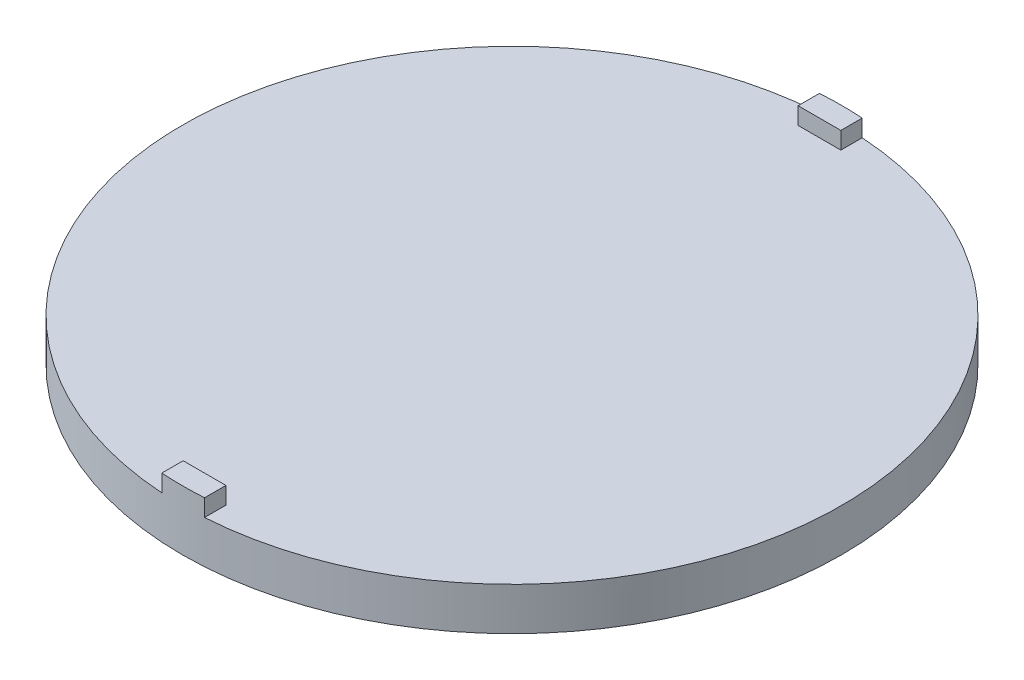
ISO-10303-21;
HEADER;
FILE_DESCRIPTION(('STEP AP214'),'2;1');
FILE_NAME('part.step','',(''),(''),'','','');
FILE_SCHEMA(('AUTOMOTIVE_DESIGN { 1 0 10303 214 1 1 1 1 }'));
ENDSEC;
DATA;
#1=APPLICATION_CONTEXT('core data for automotive mechanical design processes');
#2=APPLICATION_PROTOCOL_DEFINITION('international standard','automotive_design',2000,#1);
#3=PRODUCT_CONTEXT('',#1,'mechanical');
#4=PRODUCT('Part','Part','',(#3));
#5=PRODUCT_RELATED_PRODUCT_CATEGORY('part','',(#4));
#6=PRODUCT_DEFINITION_FORMATION('','',#4);
#7=PRODUCT_DEFINITION_CONTEXT('part definition',#1,'design');
#8=PRODUCT_DEFINITION('design','',#6,#7);
#9=PRODUCT_DEFINITION_SHAPE('','',#8);
#10=(LENGTH_UNIT() NAMED_UNIT(*) SI_UNIT(.MILLI.,.METRE.));
#11=(NAMED_UNIT(*) PLANE_ANGLE_UNIT() SI_UNIT($,.RADIAN.));
#12=(NAMED_UNIT(*) SI_UNIT($,.STERADIAN.) SOLID_ANGLE_UNIT());
#13=UNCERTAINTY_MEASURE_WITH_UNIT(LENGTH_MEASURE(1.E-05),#10,'distance_accuracy_value','');
#14=(GEOMETRIC_REPRESENTATION_CONTEXT(3) GLOBAL_UNCERTAINTY_ASSIGNED_CONTEXT((#13)) GLOBAL_UNIT_ASSIGNED_CONTEXT((#10,
#11,#12)) REPRESENTATION_CONTEXT('',''));
#15=CARTESIAN_POINT('',(0.,0.,0.));
#16=DIRECTION('',(0.,0.,1.));
#17=DIRECTION('',(1.,0.,0.));
#18=AXIS2_PLACEMENT_3D('',#15,#16,#17);
#19=CARTESIAN_POINT('',(0.,0.,0.));
#20=DIRECTION('',(0.,-1.,0.));
#21=DIRECTION('',(1.,0.,0.));
#22=AXIS2_PLACEMENT_3D('',#19,#20,#21);
#23=PLANE('',#22);
#24=DIRECTION('',(0.,0.,1.));
#25=VECTOR('',#24,1.);
#26=CARTESIAN_POINT('',(-1.58750000000001,0.,24.4259032674521));
#27=LINE('',#26,#25);
#28=CARTESIAN_POINT('',(-1.58750000000001,0.,22.8384032674521));
#29=VERTEX_POINT('',#28);
#30=CARTESIAN_POINT('',(-1.58750000000001,0.,24.4259032674521));
#31=VERTEX_POINT('',#30);
#32=EDGE_CURVE('E55',#29,#31,#27,.T.);
#33=ORIENTED_EDGE('',*,*,#32,.F.);
#34=DIRECTION('',(-1.,0.,0.));
#35=VECTOR('',#34,1.);
#36=CARTESIAN_POINT('',(-1.58750000000001,0.,22.8384032674521));
#37=LINE('',#36,#35);
#38=CARTESIAN_POINT('',(1.58750000000001,0.,22.8384032674521));
#39=VERTEX_POINT('',#38);
#40=EDGE_CURVE('E123',#39,#29,#37,.T.);
#41=ORIENTED_EDGE('',*,*,#40,.F.);
#42=DIRECTION('',(0.,0.,-1.));
#43=VECTOR('',#42,1.);
#44=CARTESIAN_POINT('',(1.58750000000001,0.,22.8384032674521));
#45=LINE('',#44,#43);
#46=CARTESIAN_POINT('',(1.58750000000001,0.,24.4259032674521));
#47=VERTEX_POINT('',#46);
#48=EDGE_CURVE('E111',#47,#39,#45,.T.);
#49=ORIENTED_EDGE('',*,*,#48,.F.);
#50=CARTESIAN_POINT('',(0.,0.,0.));
#51=DIRECTION('',(0.,-1.,0.));
#52=DIRECTION('',(1.,0.,0.));
#53=AXIS2_PLACEMENT_3D('',#50,#51,#52);
#54=CIRCLE('',#53,24.4774366852604);
#55=CARTESIAN_POINT('',(1.5875,0.,-24.4259032674521));
#56=VERTEX_POINT('',#55);
#57=EDGE_CURVE('E43',#56,#47,#54,.T.);
#58=ORIENTED_EDGE('',*,*,#57,.F.);
#59=DIRECTION('',(0.,0.,-1.));
#60=VECTOR('',#59,1.);
#61=CARTESIAN_POINT('',(1.5875,0.,-24.4259032674521));
#62=LINE('',#61,#60);
#63=CARTESIAN_POINT('',(1.5875,0.,-22.8384032674521));
#64=VERTEX_POINT('',#63);
#65=EDGE_CURVE('E63',#64,#56,#62,.T.);
#66=ORIENTED_EDGE('',*,*,#65,.F.);
#67=DIRECTION('',(1.,0.,0.));
#68=VECTOR('',#67,1.);
#69=CARTESIAN_POINT('',(1.5875,0.,-22.8384032674521));
#70=LINE('',#69,#68);
#71=CARTESIAN_POINT('',(-1.5875,0.,-22.8384032674521));
#72=VERTEX_POINT('',#71);
#73=EDGE_CURVE('E169',#72,#64,#70,.T.);
#74=ORIENTED_EDGE('',*,*,#73,.F.);
#75=DIRECTION('',(0.,0.,1.));
#76=VECTOR('',#75,1.);
#77=CARTESIAN_POINT('',(-1.5875,0.,-22.8384032674521));
#78=LINE('',#77,#76);
#79=CARTESIAN_POINT('',(-1.5875,0.,-24.4259032674521));
#80=VERTEX_POINT('',#79);
#81=EDGE_CURVE('E173',#80,#72,#78,.T.);
#82=ORIENTED_EDGE('',*,*,#81,.F.);
#83=EDGE_CURVE('E130',#31,#80,#54,.T.);
#84=ORIENTED_EDGE('',*,*,#83,.F.);
#85=EDGE_LOOP('',(#33,#41,#49,#58,#66,#74,#82,#84));
#86=FACE_BOUND('',#85,.T.);
#87=ADVANCED_FACE('F39',(#86),#23,.F.);
#88=CARTESIAN_POINT('',(0.,-3.175,0.));
#89=DIRECTION('',(0.,1.,0.));
#90=DIRECTION('',(-1.,0.,0.));
#91=AXIS2_PLACEMENT_3D('',#88,#89,#90);
#92=CYLINDRICAL_SURFACE('',#91,24.4774366852604);
#93=CARTESIAN_POINT('',(0.,-3.175,0.));
#94=DIRECTION('',(0.,-1.,0.));
#95=DIRECTION('',(1.,0.,0.));
#96=AXIS2_PLACEMENT_3D('',#93,#94,#95);
#97=CIRCLE('',#96,24.4774366852604);
#98=CARTESIAN_POINT('',(24.4774366852604,-3.175,0.));
#99=VERTEX_POINT('',#98);
#100=EDGE_CURVE('E11',#99,#99,#97,.T.);
#101=ORIENTED_EDGE('',*,*,#100,.F.);
#102=EDGE_LOOP('',(#101));
#103=FACE_BOUND('',#102,.T.);
#104=ORIENTED_EDGE('',*,*,#57,.T.);
#105=DIRECTION('',(0.,-1.,0.));
#106=VECTOR('',#105,1.);
#107=CARTESIAN_POINT('',(1.58750000000001,4.84310167007491,24.4259032674521));
#108=LINE('',#107,#106);
#109=CARTESIAN_POINT('',(1.58750000000001,1.27,24.4259032674521));
#110=VERTEX_POINT('',#109);
#111=EDGE_CURVE('E107',#110,#47,#108,.T.);
#112=ORIENTED_EDGE('',*,*,#111,.F.);
#113=CARTESIAN_POINT('',(0.,1.27,0.));
#114=DIRECTION('',(0.,-1.,0.));
#115=DIRECTION('',(1.,0.,0.));
#116=AXIS2_PLACEMENT_3D('',#113,#114,#115);
#117=CIRCLE('',#116,24.4774366852604);
#118=CARTESIAN_POINT('',(-1.58750000000001,1.27,24.4259032674521));
#119=VERTEX_POINT('',#118);
#120=EDGE_CURVE('E177',#110,#119,#117,.T.);
#121=ORIENTED_EDGE('',*,*,#120,.T.);
#122=DIRECTION('',(0.,-1.,0.));
#123=VECTOR('',#122,1.);
#124=CARTESIAN_POINT('',(-1.58750000000001,4.84310167007491,24.4259032674521));
#125=LINE('',#124,#123);
#126=EDGE_CURVE('E186',#119,#31,#125,.T.);
#127=ORIENTED_EDGE('',*,*,#126,.T.);
#128=ORIENTED_EDGE('',*,*,#83,.T.);
#129=DIRECTION('',(0.,-1.,0.));
#130=VECTOR('',#129,1.);
#131=CARTESIAN_POINT('',(-1.5875,4.84310167007491,-24.4259032674521));
#132=LINE('',#131,#130);
#133=CARTESIAN_POINT('',(-1.5875,1.27,-24.4259032674521));
#134=VERTEX_POINT('',#133);
#135=EDGE_CURVE('E155',#134,#80,#132,.T.);
#136=ORIENTED_EDGE('',*,*,#135,.F.);
#137=CARTESIAN_POINT('',(0.,1.27,0.));
#138=DIRECTION('',(0.,-1.,0.));
#139=DIRECTION('',(1.,0.,0.));
#140=AXIS2_PLACEMENT_3D('',#137,#138,#139);
#141=CIRCLE('',#140,24.4774366852604);
#142=CARTESIAN_POINT('',(1.5875,1.27,-24.4259032674521));
#143=VERTEX_POINT('',#142);
#144=EDGE_CURVE('E134',#134,#143,#141,.T.);
#145=ORIENTED_EDGE('',*,*,#144,.T.);
#146=DIRECTION('',(0.,-1.,0.));
#147=VECTOR('',#146,1.);
#148=CARTESIAN_POINT('',(1.5875,4.84310167007491,-24.4259032674521));
#149=LINE('',#148,#147);
#150=EDGE_CURVE('E128',#143,#56,#149,.T.);
#151=ORIENTED_EDGE('',*,*,#150,.T.);
#152=EDGE_LOOP('',(#104,#112,#121,#127,#128,#136,#145,#151));
#153=FACE_BOUND('',#152,.T.);
#154=ADVANCED_FACE('F41',(#103,#153),#92,.T.);
#155=CARTESIAN_POINT('',(0.,-3.175,0.));
#156=DIRECTION('',(0.,-1.,0.));
#157=DIRECTION('',(1.,0.,0.));
#158=AXIS2_PLACEMENT_3D('',#155,#156,#157);
#159=PLANE('',#158);
#160=ORIENTED_EDGE('',*,*,#100,.T.);
#161=EDGE_LOOP('',(#160));
#162=FACE_BOUND('',#161,.T.);
#163=ADVANCED_FACE('F220',(#162),#159,.T.);
#164=CARTESIAN_POINT('',(1.5875,4.84310167007491,-24.4259032674521));
#165=DIRECTION('',(-1.,0.,0.));
#166=DIRECTION('',(0.,0.,1.));
#167=AXIS2_PLACEMENT_3D('',#164,#165,#166);
#168=PLANE('',#167);
#169=ORIENTED_EDGE('',*,*,#150,.F.);
#170=DIRECTION('',(0.,0.,1.));
#171=VECTOR('',#170,1.);
#172=CARTESIAN_POINT('',(1.5875,1.27,-24.4259032674521));
#173=LINE('',#172,#171);
#174=CARTESIAN_POINT('',(1.5875,1.27,-22.8384032674521));
#175=VERTEX_POINT('',#174);
#176=EDGE_CURVE('E151',#143,#175,#173,.T.);
#177=ORIENTED_EDGE('',*,*,#176,.T.);
#178=DIRECTION('',(0.,-1.,0.));
#179=VECTOR('',#178,1.);
#180=CARTESIAN_POINT('',(1.5875,4.84310167007491,-22.8384032674521));
#181=LINE('',#180,#179);
#182=EDGE_CURVE('E162',#175,#64,#181,.T.);
#183=ORIENTED_EDGE('',*,*,#182,.T.);
#184=ORIENTED_EDGE('',*,*,#65,.T.);
#185=EDGE_LOOP('',(#169,#177,#183,#184));
#186=FACE_BOUND('',#185,.T.);
#187=ADVANCED_FACE('F210',(#186),#168,.F.);
#188=CARTESIAN_POINT('',(1.5875,4.84310167007491,-22.8384032674521));
#189=DIRECTION('',(0.,0.,-1.));
#190=DIRECTION('',(-1.,0.,0.));
#191=AXIS2_PLACEMENT_3D('',#188,#189,#190);
#192=PLANE('',#191);
#193=ORIENTED_EDGE('',*,*,#182,.F.);
#194=DIRECTION('',(-1.,0.,0.));
#195=VECTOR('',#194,1.);
#196=CARTESIAN_POINT('',(1.5875,1.27,-22.8384032674521));
#197=LINE('',#196,#195);
#198=CARTESIAN_POINT('',(-1.5875,1.27,-22.8384032674521));
#199=VERTEX_POINT('',#198);
#200=EDGE_CURVE('E145',#175,#199,#197,.T.);
#201=ORIENTED_EDGE('',*,*,#200,.T.);
#202=DIRECTION('',(0.,-1.,0.));
#203=VECTOR('',#202,1.);
#204=CARTESIAN_POINT('',(-1.5875,4.84310167007491,-22.8384032674521));
#205=LINE('',#204,#203);
#206=EDGE_CURVE('E158',#199,#72,#205,.T.);
#207=ORIENTED_EDGE('',*,*,#206,.T.);
#208=ORIENTED_EDGE('',*,*,#73,.T.);
#209=EDGE_LOOP('',(#193,#201,#207,#208));
#210=FACE_BOUND('',#209,.T.);
#211=ADVANCED_FACE('F212',(#210),#192,.F.);
#212=CARTESIAN_POINT('',(-1.5875,4.84310167007491,-22.8384032674521));
#213=DIRECTION('',(1.,0.,0.));
#214=DIRECTION('',(0.,0.,-1.));
#215=AXIS2_PLACEMENT_3D('',#212,#213,#214);
#216=PLANE('',#215);
#217=ORIENTED_EDGE('',*,*,#206,.F.);
#218=DIRECTION('',(0.,0.,-1.));
#219=VECTOR('',#218,1.);
#220=CARTESIAN_POINT('',(-1.5875,1.27,-22.8384032674521));
#221=LINE('',#220,#219);
#222=EDGE_CURVE('E140',#199,#134,#221,.T.);
#223=ORIENTED_EDGE('',*,*,#222,.T.);
#224=ORIENTED_EDGE('',*,*,#135,.T.);
#225=ORIENTED_EDGE('',*,*,#81,.T.);
#226=EDGE_LOOP('',(#217,#223,#224,#225));
#227=FACE_BOUND('',#226,.T.);
#228=ADVANCED_FACE('F205',(#227),#216,.F.);
#229=CARTESIAN_POINT('',(0.,1.27,0.));
#230=DIRECTION('',(0.,-1.,0.));
#231=DIRECTION('',(0.,0.,1.));
#232=AXIS2_PLACEMENT_3D('',#229,#230,#231);
#233=PLANE('',#232);
#234=ORIENTED_EDGE('',*,*,#144,.F.);
#235=ORIENTED_EDGE('',*,*,#222,.F.);
#236=ORIENTED_EDGE('',*,*,#200,.F.);
#237=ORIENTED_EDGE('',*,*,#176,.F.);
#238=EDGE_LOOP('',(#234,#235,#236,#237));
#239=FACE_BOUND('',#238,.T.);
#240=ADVANCED_FACE('F207',(#239),#233,.F.);
#241=CARTESIAN_POINT('',(-1.58750000000001,4.84310167007491,24.4259032674521));
#242=DIRECTION('',(1.,0.,0.));
#243=DIRECTION('',(0.,0.,-1.));
#244=AXIS2_PLACEMENT_3D('',#241,#242,#243);
#245=PLANE('',#244);
#246=ORIENTED_EDGE('',*,*,#126,.F.);
#247=DIRECTION('',(0.,0.,-1.));
#248=VECTOR('',#247,1.);
#249=CARTESIAN_POINT('',(-1.58750000000001,1.27,24.4259032674521));
#250=LINE('',#249,#248);
#251=CARTESIAN_POINT('',(-1.58750000000001,1.27,22.8384032674521));
#252=VERTEX_POINT('',#251);
#253=EDGE_CURVE('E118',#119,#252,#250,.T.);
#254=ORIENTED_EDGE('',*,*,#253,.T.);
#255=DIRECTION('',(0.,-1.,0.));
#256=VECTOR('',#255,1.);
#257=CARTESIAN_POINT('',(-1.58750000000001,4.84310167007491,22.8384032674521));
#258=LINE('',#257,#256);
#259=EDGE_CURVE('E183',#252,#29,#258,.T.);
#260=ORIENTED_EDGE('',*,*,#259,.T.);
#261=ORIENTED_EDGE('',*,*,#32,.T.);
#262=EDGE_LOOP('',(#246,#254,#260,#261));
#263=FACE_BOUND('',#262,.T.);
#264=ADVANCED_FACE('F202',(#263),#245,.F.);
#265=CARTESIAN_POINT('',(-1.58750000000001,4.84310167007491,22.8384032674521));
#266=DIRECTION('',(0.,0.,1.));
#267=DIRECTION('',(1.,0.,0.));
#268=AXIS2_PLACEMENT_3D('',#265,#266,#267);
#269=PLANE('',#268);
#270=ORIENTED_EDGE('',*,*,#259,.F.);
#271=DIRECTION('',(1.,0.,0.));
#272=VECTOR('',#271,1.);
#273=CARTESIAN_POINT('',(-1.58750000000001,1.27,22.8384032674521));
#274=LINE('',#273,#272);
#275=CARTESIAN_POINT('',(1.58750000000001,1.27,22.8384032674521));
#276=VERTEX_POINT('',#275);
#277=EDGE_CURVE('E179',#252,#276,#274,.T.);
#278=ORIENTED_EDGE('',*,*,#277,.T.);
#279=DIRECTION('',(0.,-1.,0.));
#280=VECTOR('',#279,1.);
#281=CARTESIAN_POINT('',(1.58750000000001,4.84310167007491,22.8384032674521));
#282=LINE('',#281,#280);
#283=EDGE_CURVE('E119',#276,#39,#282,.T.);
#284=ORIENTED_EDGE('',*,*,#283,.T.);
#285=ORIENTED_EDGE('',*,*,#40,.T.);
#286=EDGE_LOOP('',(#270,#278,#284,#285));
#287=FACE_BOUND('',#286,.T.);
#288=ADVANCED_FACE('F199',(#287),#269,.F.);
#289=CARTESIAN_POINT('',(1.58750000000001,4.84310167007491,22.8384032674521));
#290=DIRECTION('',(-1.,0.,0.));
#291=DIRECTION('',(0.,0.,1.));
#292=AXIS2_PLACEMENT_3D('',#289,#290,#291);
#293=PLANE('',#292);
#294=ORIENTED_EDGE('',*,*,#283,.F.);
#295=DIRECTION('',(0.,0.,1.));
#296=VECTOR('',#295,1.);
#297=CARTESIAN_POINT('',(1.58750000000001,1.27,22.8384032674521));
#298=LINE('',#297,#296);
#299=EDGE_CURVE('E113',#276,#110,#298,.T.);
#300=ORIENTED_EDGE('',*,*,#299,.T.);
#301=ORIENTED_EDGE('',*,*,#111,.T.);
#302=ORIENTED_EDGE('',*,*,#48,.T.);
#303=EDGE_LOOP('',(#294,#300,#301,#302));
#304=FACE_BOUND('',#303,.T.);
#305=ADVANCED_FACE('F110',(#304),#293,.F.);
#306=CARTESIAN_POINT('',(0.,1.27,0.));
#307=DIRECTION('',(0.,-1.,0.));
#308=DIRECTION('',(0.,0.,1.));
#309=AXIS2_PLACEMENT_3D('',#306,#307,#308);
#310=PLANE('',#309);
#311=ORIENTED_EDGE('',*,*,#299,.F.);
#312=ORIENTED_EDGE('',*,*,#277,.F.);
#313=ORIENTED_EDGE('',*,*,#253,.F.);
#314=ORIENTED_EDGE('',*,*,#120,.F.);
#315=EDGE_LOOP('',(#311,#312,#313,#314));
#316=FACE_BOUND('',#315,.T.);
#317=ADVANCED_FACE('F201',(#316),#310,.F.);
#318=CLOSED_SHELL('',(#87,#154,#163,#187,#211,#228,#240,#264,#288,#305,#317));
#319=MANIFOLD_SOLID_BREP('B2',#318);
#320=ADVANCED_BREP_SHAPE_REPRESENTATION('',(#18,#319),#14);
#321=SHAPE_DEFINITION_REPRESENTATION(#9,#320);
ENDSEC;
END-ISO-10303-21;
